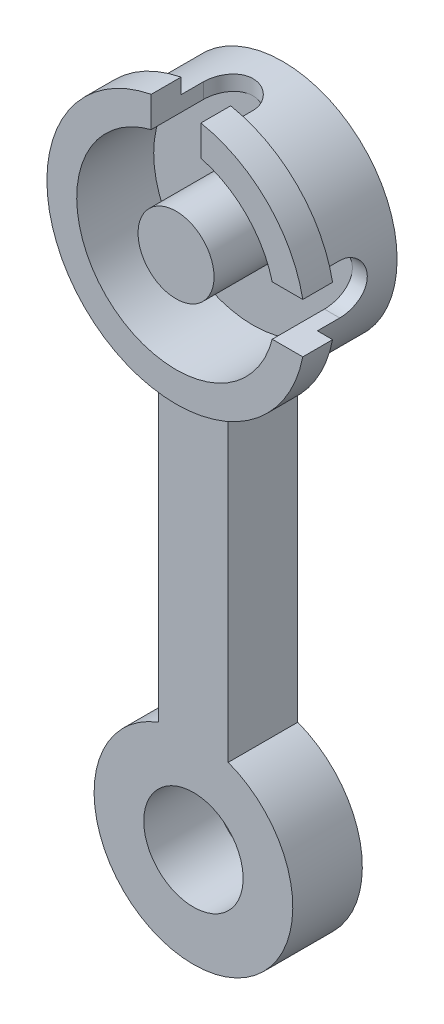
ISO-10303-21;
HEADER;
FILE_DESCRIPTION(('STEP AP214'),'2;1');
FILE_NAME('part.step','',(''),(''),'','','');
FILE_SCHEMA(('AUTOMOTIVE_DESIGN { 1 0 10303 214 1 1 1 1 }'));
ENDSEC;
DATA;
#1=APPLICATION_CONTEXT('core data for automotive mechanical design processes');
#2=APPLICATION_PROTOCOL_DEFINITION('international standard','automotive_design',2000,#1);
#3=PRODUCT_CONTEXT('',#1,'mechanical');
#4=PRODUCT('Part','Part','',(#3));
#5=PRODUCT_RELATED_PRODUCT_CATEGORY('part','',(#4));
#6=PRODUCT_DEFINITION_FORMATION('','',#4);
#7=PRODUCT_DEFINITION_CONTEXT('part definition',#1,'design');
#8=PRODUCT_DEFINITION('design','',#6,#7);
#9=PRODUCT_DEFINITION_SHAPE('','',#8);
#10=(LENGTH_UNIT() NAMED_UNIT(*) SI_UNIT(.MILLI.,.METRE.));
#11=(NAMED_UNIT(*) PLANE_ANGLE_UNIT() SI_UNIT($,.RADIAN.));
#12=(NAMED_UNIT(*) SI_UNIT($,.STERADIAN.) SOLID_ANGLE_UNIT());
#13=UNCERTAINTY_MEASURE_WITH_UNIT(LENGTH_MEASURE(1.E-05),#10,'distance_accuracy_value','');
#14=(GEOMETRIC_REPRESENTATION_CONTEXT(3) GLOBAL_UNCERTAINTY_ASSIGNED_CONTEXT((#13)) GLOBAL_UNIT_ASSIGNED_CONTEXT((#10,
#11,#12)) REPRESENTATION_CONTEXT('',''));
#15=CARTESIAN_POINT('',(0.,0.,0.));
#16=DIRECTION('',(0.,0.,1.));
#17=DIRECTION('',(1.,0.,0.));
#18=AXIS2_PLACEMENT_3D('',#15,#16,#17);
#19=CARTESIAN_POINT('',(0.,0.,10.75));
#20=DIRECTION('',(0.,0.,1.));
#21=DIRECTION('',(1.,0.,0.));
#22=AXIS2_PLACEMENT_3D('',#19,#20,#21);
#23=PLANE('',#22);
#24=DIRECTION('',(1.,0.,0.));
#25=VECTOR('',#24,1.);
#26=CARTESIAN_POINT('',(-13.001,2.5,10.75));
#27=LINE('',#26,#25);
#28=CARTESIAN_POINT('',(9.68245836551854,2.5,10.75));
#29=VERTEX_POINT('',#28);
#30=CARTESIAN_POINT('',(12.7573508221731,2.5,10.75));
#31=VERTEX_POINT('',#30);
#32=EDGE_CURVE('E188',#29,#31,#27,.T.);
#33=ORIENTED_EDGE('',*,*,#32,.T.);
#34=CARTESIAN_POINT('',(0.,0.,10.75));
#35=DIRECTION('',(0.,0.,1.));
#36=DIRECTION('',(1.,0.,0.));
#37=AXIS2_PLACEMENT_3D('',#34,#35,#36);
#38=CIRCLE('',#37,13.);
#39=CARTESIAN_POINT('',(2.5,12.7573508221731,10.75));
#40=VERTEX_POINT('',#39);
#41=EDGE_CURVE('E296',#31,#40,#38,.T.);
#42=ORIENTED_EDGE('',*,*,#41,.T.);
#43=DIRECTION('',(0.,-1.,0.));
#44=VECTOR('',#43,1.);
#45=CARTESIAN_POINT('',(2.5,13.,10.75));
#46=LINE('',#45,#44);
#47=CARTESIAN_POINT('',(2.5,9.68245836551854,10.75));
#48=VERTEX_POINT('',#47);
#49=EDGE_CURVE('E409',#40,#48,#46,.T.);
#50=ORIENTED_EDGE('',*,*,#49,.T.);
#51=CARTESIAN_POINT('',(0.,0.,10.75));
#52=DIRECTION('',(0.,0.,1.));
#53=DIRECTION('',(1.,0.,0.));
#54=AXIS2_PLACEMENT_3D('',#51,#52,#53);
#55=CIRCLE('',#54,10.);
#56=EDGE_CURVE('E272',#29,#48,#55,.T.);
#57=ORIENTED_EDGE('',*,*,#56,.F.);
#58=EDGE_LOOP('',(#33,#42,#50,#57));
#59=FACE_BOUND('',#58,.T.);
#60=ADVANCED_FACE('F49',(#59),#23,.T.);
#61=CARTESIAN_POINT('',(0.,0.,7.75));
#62=DIRECTION('',(0.,0.,1.));
#63=DIRECTION('',(1.,0.,0.));
#64=AXIS2_PLACEMENT_3D('',#61,#62,#63);
#65=PLANE('',#64);
#66=CARTESIAN_POINT('',(0.,0.,7.75));
#67=DIRECTION('',(0.,0.,1.));
#68=DIRECTION('',(1.,0.,0.));
#69=AXIS2_PLACEMENT_3D('',#66,#67,#68);
#70=CIRCLE('',#69,13.);
#71=CARTESIAN_POINT('',(12.7573508221731,2.5,7.75));
#72=VERTEX_POINT('',#71);
#73=CARTESIAN_POINT('',(2.5,12.7573508221731,7.75));
#74=VERTEX_POINT('',#73);
#75=EDGE_CURVE('E293',#72,#74,#70,.T.);
#76=ORIENTED_EDGE('',*,*,#75,.F.);
#77=DIRECTION('',(-1.,0.,0.));
#78=VECTOR('',#77,1.);
#79=CARTESIAN_POINT('',(0.,2.5,7.75));
#80=LINE('',#79,#78);
#81=CARTESIAN_POINT('',(11.2249721603218,2.5,7.75));
#82=VERTEX_POINT('',#81);
#83=EDGE_CURVE('E396',#72,#82,#80,.T.);
#84=ORIENTED_EDGE('',*,*,#83,.T.);
#85=CARTESIAN_POINT('',(0.,0.,7.75));
#86=DIRECTION('',(0.,0.,1.));
#87=DIRECTION('',(1.,0.,0.));
#88=AXIS2_PLACEMENT_3D('',#85,#86,#87);
#89=CIRCLE('',#88,11.5);
#90=CARTESIAN_POINT('',(2.5,11.2249721603218,7.75));
#91=VERTEX_POINT('',#90);
#92=EDGE_CURVE('E286',#82,#91,#89,.T.);
#93=ORIENTED_EDGE('',*,*,#92,.T.);
#94=DIRECTION('',(0.,-1.,0.));
#95=VECTOR('',#94,1.);
#96=CARTESIAN_POINT('',(2.5,0.,7.75));
#97=LINE('',#96,#95);
#98=EDGE_CURVE('E509',#74,#91,#97,.T.);
#99=ORIENTED_EDGE('',*,*,#98,.F.);
#100=EDGE_LOOP('',(#76,#84,#93,#99));
#101=FACE_BOUND('',#100,.T.);
#102=ADVANCED_FACE('F231',(#101),#65,.F.);
#103=CARTESIAN_POINT('',(0.,0.,3.));
#104=DIRECTION('',(0.,0.,1.));
#105=DIRECTION('',(1.,0.,0.));
#106=AXIS2_PLACEMENT_3D('',#103,#104,#105);
#107=CYLINDRICAL_SURFACE('',#106,10.);
#108=CARTESIAN_POINT('',(9.68245836551854,2.5,5.5));
#109=CARTESIAN_POINT('',(9.68245064111954,2.50000800974504,5.43086227280621));
#110=CARTESIAN_POINT('',(9.68319871091904,2.49713210596378,5.36172929639093));
#111=CARTESIAN_POINT('',(9.68614914952023,2.48567468034436,5.2239803055767));
#112=CARTESIAN_POINT('',(9.68835127361669,2.47709411855104,5.15536420615649));
#113=CARTESIAN_POINT('',(9.69414684169818,2.45431205402949,5.01926728400853));
#114=CARTESIAN_POINT('',(9.69773753079726,2.44012167982618,4.95178448771837));
#115=CARTESIAN_POINT('',(9.70619671915876,2.40625177112362,4.81831129889242));
#116=CARTESIAN_POINT('',(9.71106523596932,2.38657216124157,4.75232092686532));
#117=CARTESIAN_POINT('',(9.72738389223981,2.3195147166506,4.5572876221195));
#118=CARTESIAN_POINT('',(9.74055328364126,2.26409556017785,4.43104808852016));
#119=CARTESIAN_POINT('',(9.76997943748827,2.13353026793965,4.18969003166774));
#120=CARTESIAN_POINT('',(9.78623691860425,2.0583795386182,4.07457410656478));
#121=CARTESIAN_POINT('',(9.82040471070009,1.88872144910605,3.85615879668431));
#122=CARTESIAN_POINT('',(9.83834118174241,1.79386340609068,3.75313540100376));
#123=CARTESIAN_POINT('',(9.8736241781519,1.5882101662538,3.56425976600193));
#124=CARTESIAN_POINT('',(9.89097048991423,1.47740927331203,3.47841369017582));
#125=CARTESIAN_POINT('',(9.92341282190624,1.24108599319256,3.32518457241635));
#126=CARTESIAN_POINT('',(9.93847296605804,1.11537511690239,3.25808424707065));
#127=CARTESIAN_POINT('',(9.96431943243333,0.854105761894246,3.14614104580278));
#128=CARTESIAN_POINT('',(9.97511087403299,0.718559311205587,3.10127149251002));
#129=CARTESIAN_POINT('',(9.98867229260218,0.485279343468635,3.04560969025209));
#130=CARTESIAN_POINT('',(9.9928981973571,0.389082296243319,3.02853552258369));
#131=CARTESIAN_POINT('',(9.99856328967575,0.195270005752428,3.00572864199598));
#132=CARTESIAN_POINT('',(10.0000025178695,0.0976547831848832,2.99999576371964));
#133=CARTESIAN_POINT('',(9.99999643984856,-0.138079364435491,3.00000598990527));
#134=CARTESIAN_POINT('',(9.99711044622291,-0.2762378210569,3.01148199624813));
#135=CARTESIAN_POINT('',(9.98587211243723,-0.548630748226368,3.05702817811172));
#136=CARTESIAN_POINT('',(9.97751456301735,-0.682861351858222,3.09111988559121));
#137=CARTESIAN_POINT('',(9.95626003812502,-0.943370540040465,3.18073355599173));
#138=CARTESIAN_POINT('',(9.9433692599934,-1.06965970480532,3.23622627172547));
#139=CARTESIAN_POINT('',(9.9144214653489,-1.31112745670224,3.36697347226555));
#140=CARTESIAN_POINT('',(9.89836452937225,-1.42630632633127,3.442227454429));
#141=CARTESIAN_POINT('',(9.86445729325103,-1.64466717764041,3.61199909260045));
#142=CARTESIAN_POINT('',(9.84657931691399,-1.74758787227268,3.70684729452461));
#143=CARTESIAN_POINT('',(9.81122777715724,-1.93624440690088,3.91241613789223));
#144=CARTESIAN_POINT('',(9.79375427851752,-2.02197751079625,4.02313930167405));
#145=CARTESIAN_POINT('',(9.76090816361151,-2.17506654391142,4.25935711490929));
#146=CARTESIAN_POINT('',(9.7455713425268,-2.24212473012634,4.38504994898195));
#147=CARTESIAN_POINT('',(9.7191510873392,-2.35402373300668,4.64634157014611));
#148=CARTESIAN_POINT('',(9.70806446116543,-2.39888123069792,4.78193283163854));
#149=CARTESIAN_POINT('',(9.69412529347839,-2.45448264347137,5.0152094996293));
#150=CARTESIAN_POINT('',(9.68977829435311,-2.47152506219244,5.11135088492528));
#151=CARTESIAN_POINT('',(9.68393257034592,-2.49429083020696,5.30497755356269));
#152=CARTESIAN_POINT('',(9.68243179415941,-2.50002233152573,5.40246181799697));
#153=CARTESIAN_POINT('',(9.68245836551854,-2.5,5.5));
#154=B_SPLINE_CURVE_WITH_KNOTS('',3,(#108,#109,#110,#111,#112,#113,#114,#115,#116,#117,#118,
#119,#120,#121,#122,#123,#124,#125,#126,#127,#128,#129,#130,#131,#132,#133,#134,#135,#136,#137,
#138,#139,#140,#141,#142,#143,#144,#145,#146,#147,#148,#149,#150,#151,#152,#153),.UNSPECIFIED.,
.F.,.F.,(4,2,2,2,2,2,2,2,2,2,2,2,2,2,2,2,2,2,2,2,2,2,4),(0.,0.207341152049354,0.414647419197843,
0.621544487536569,0.828444397299515,1.24183999916585,1.65533192595269,2.0769323957609,
2.49868387230349,2.92648938525965,3.35378027205341,3.64649296502377,3.93920139018486,
4.35307761818935,4.76734845612808,5.1810551353743,5.59475129269416,6.01609891165583,
6.43751355197311,6.86530561437562,7.29277575498499,7.58532050743325,7.87765433937318),.UNSPECIFIED.);
#155=CARTESIAN_POINT('',(9.68245836551854,2.5,5.5));
#156=VERTEX_POINT('',#155);
#157=CARTESIAN_POINT('',(10.,0.,3.));
#158=VERTEX_POINT('',#157);
#159=EDGE_CURVE('E65',#156,#158,#154,.T.);
#160=ORIENTED_EDGE('',*,*,#159,.F.);
#161=DIRECTION('',(0.,0.,1.));
#162=VECTOR('',#161,1.);
#163=CARTESIAN_POINT('',(9.68245836551854,2.5,3.));
#164=LINE('',#163,#162);
#165=EDGE_CURVE('E192',#29,#156,#164,.F.);
#166=ORIENTED_EDGE('',*,*,#165,.F.);
#167=ORIENTED_EDGE('',*,*,#56,.T.);
#168=DIRECTION('',(0.,0.,1.));
#169=VECTOR('',#168,1.);
#170=CARTESIAN_POINT('',(2.5,9.68245836551854,3.));
#171=LINE('',#170,#169);
#172=CARTESIAN_POINT('',(2.5,9.68245836551854,5.5));
#173=VERTEX_POINT('',#172);
#174=EDGE_CURVE('E11',#173,#48,#171,.T.);
#175=ORIENTED_EDGE('',*,*,#174,.F.);
#176=CARTESIAN_POINT('',(-2.5,9.68245836551854,5.5));
#177=CARTESIAN_POINT('',(-2.5000080093561,9.68245064107173,5.43086221485037));
#178=CARTESIAN_POINT('',(-2.49713210094488,9.68319871214971,5.361729180435));
#179=CARTESIAN_POINT('',(-2.4856746565857,9.68614915569249,5.22398007541582));
#180=CARTESIAN_POINT('',(-2.477094080727,9.68835128344071,5.15536391978676));
#181=CARTESIAN_POINT('',(-2.4543119967113,9.69414685608169,5.01926700190048));
#182=CARTESIAN_POINT('',(-2.4401216265234,9.69773754375151,4.95178426440452));
#183=CARTESIAN_POINT('',(-2.40625174004096,9.70619672728078,4.81831118968971));
#184=CARTESIAN_POINT('',(-2.3865721482595,9.71106524071264,4.7523208730079));
#185=CARTESIAN_POINT('',(-2.31951549528412,9.7273836995917,4.55728991890444));
#186=CARTESIAN_POINT('',(-2.26409745840538,9.74055281563065,4.4310525501598));
#187=CARTESIAN_POINT('',(-2.13353299875773,9.76997886207529,4.18969412537827));
#188=CARTESIAN_POINT('',(-2.05838128580475,9.78623662015741,4.07457606152992));
#189=CARTESIAN_POINT('',(-1.88871268115754,9.82040642202059,3.85614780909068));
#190=CARTESIAN_POINT('',(-1.79384357452292,9.83834473874501,3.75311479878795));
#191=CARTESIAN_POINT('',(-1.58818904866331,9.87362764688863,3.56424276156979));
#192=CARTESIAN_POINT('',(-1.47740109012642,9.89097214303631,3.47840648304886));
#193=CARTESIAN_POINT('',(-1.24114235858888,9.92340454696925,3.32522304681061));
#194=CARTESIAN_POINT('',(-1.11548838031036,9.93845761433587,3.25815040752711));
#195=CARTESIAN_POINT('',(-0.854256447638928,9.96430865897157,3.14618801705023));
#196=CARTESIAN_POINT('',(-0.718680452386957,9.97510747358589,3.10129390011676));
#197=CARTESIAN_POINT('',(-0.44436027897514,9.99104749942438,3.03585255639782));
#198=CARTESIAN_POINT('',(-0.305735807058583,9.99629882234408,3.01483082920823));
#199=CARTESIAN_POINT('',(-0.026831937153017,10.0009359539588,2.99624156087777));
#200=CARTESIAN_POINT('',(0.11344725061566,10.0003224998861,2.99867107179753));
#201=CARTESIAN_POINT('',(0.388381231898417,9.99338093409452,3.02657491187484));
#202=CARTESIAN_POINT('',(0.523091754207089,9.98717996692084,3.05153654221199));
#203=CARTESIAN_POINT('',(0.786346777853404,9.96990826592558,3.12297169724353));
#204=CARTESIAN_POINT('',(0.914891006098329,9.95883731664275,3.1694461737295));
#205=CARTESIAN_POINT('',(1.16351821502264,9.93287494404107,3.2830032018703));
#206=CARTESIAN_POINT('',(1.28351407399524,9.91794984568668,3.35026848563402));
#207=CARTESIAN_POINT('',(1.51069157808542,9.88589863855019,3.50335782453174));
#208=CARTESIAN_POINT('',(1.61787128890855,9.86877219833489,3.58918467561906));
#209=CARTESIAN_POINT('',(1.81942347426832,9.83363915056657,3.77969728021763));
#210=CARTESIAN_POINT('',(1.9133727576345,9.81562126192392,3.88482909135298));
#211=CARTESIAN_POINT('',(2.08242393796641,9.78115420711838,4.10957466731588));
#212=CARTESIAN_POINT('',(2.15752067561301,9.76470547114267,4.22919238320947));
#213=CARTESIAN_POINT('',(2.28701177321454,9.73519533958994,4.48036399455884));
#214=CARTESIAN_POINT('',(2.34129254471755,9.72215264997332,4.61197866223443));
#215=CARTESIAN_POINT('',(2.42675587962519,9.70117647043109,4.88279232105148));
#216=CARTESIAN_POINT('',(2.45797297303244,9.693235344986,5.02197963789711));
#217=CARTESIAN_POINT('',(2.48476158787698,9.6863822666606,5.21864345189183));
#218=CARTESIAN_POINT('',(2.49047697741524,9.68491307675692,5.27479925801593));
#219=CARTESIAN_POINT('',(2.49809189424097,9.6829515607634,5.38729447474745));
#220=CARTESIAN_POINT('',(2.49999759523778,9.68245765421489,5.44363343986511));
#221=CARTESIAN_POINT('',(2.5,9.68245836551854,5.5));
#222=B_SPLINE_CURVE_WITH_KNOTS('',3,(#176,#177,#178,#179,#180,#181,#182,#183,#184,#185,#186,
#187,#188,#189,#190,#191,#192,#193,#194,#195,#196,#197,#198,#199,#200,#201,#202,#203,#204,#205,
#206,#207,#208,#209,#210,#211,#212,#213,#214,#215,#216,#217,#218,#219,#220,#221),.UNSPECIFIED.,
.F.,.F.,(4,2,2,2,2,2,2,2,2,2,2,2,2,2,2,2,2,2,2,2,2,2,4),(0.,0.207341325849423,0.414647765211628,
0.621544658575865,0.82844439729415,1.24183269482211,1.65533192641023,2.07697423316329,
2.49868387344134,2.92627416704923,3.35378025790397,3.77263152747648,4.19143014600933,
4.60093312657524,5.01045422648931,5.42368222585276,5.83697251370157,6.26140522795691,
6.68595396911754,7.11278749362004,7.538980678093,7.70826570767018,7.87727618290648),.UNSPECIFIED.);
#223=CARTESIAN_POINT('',(0.,10.,3.));
#224=VERTEX_POINT('',#223);
#225=EDGE_CURVE('E430',#224,#173,#222,.T.);
#226=ORIENTED_EDGE('',*,*,#225,.F.);
#227=CARTESIAN_POINT('',(0.,0.,3.));
#228=DIRECTION('',(0.,0.,1.));
#229=DIRECTION('',(1.,0.,0.));
#230=AXIS2_PLACEMENT_3D('',#227,#228,#229);
#231=CIRCLE('',#230,10.);
#232=EDGE_CURVE('E203',#158,#224,#231,.T.);
#233=ORIENTED_EDGE('',*,*,#232,.F.);
#234=EDGE_LOOP('',(#160,#166,#167,#175,#226,#233));
#235=FACE_BOUND('',#234,.T.);
#236=ADVANCED_FACE('F201',(#235),#107,.F.);
#237=DIRECTION('',(1.,0.,0.));
#238=VECTOR('',#237,1.);
#239=CARTESIAN_POINT('',(-13.001,-2.5,10.75));
#240=LINE('',#239,#238);
#241=CARTESIAN_POINT('',(9.68245836551854,-2.5,10.75));
#242=VERTEX_POINT('',#241);
#243=CARTESIAN_POINT('',(12.7573508221731,-2.5,10.75));
#244=VERTEX_POINT('',#243);
#245=EDGE_CURVE('E259',#242,#244,#240,.T.);
#246=ORIENTED_EDGE('',*,*,#245,.F.);
#247=CARTESIAN_POINT('',(-2.5,9.68245836551854,10.75));
#248=VERTEX_POINT('',#247);
#249=EDGE_CURVE('E261',#248,#242,#55,.T.);
#250=ORIENTED_EDGE('',*,*,#249,.F.);
#251=DIRECTION('',(0.,-1.,0.));
#252=VECTOR('',#251,1.);
#253=CARTESIAN_POINT('',(-2.5,13.,10.75));
#254=LINE('',#253,#252);
#255=CARTESIAN_POINT('',(-2.5,12.7573508221731,10.75));
#256=VERTEX_POINT('',#255);
#257=EDGE_CURVE('E73',#256,#248,#254,.T.);
#258=ORIENTED_EDGE('',*,*,#257,.F.);
#259=EDGE_CURVE('E263',#256,#244,#38,.T.);
#260=ORIENTED_EDGE('',*,*,#259,.T.);
#261=EDGE_LOOP('',(#246,#250,#258,#260));
#262=FACE_BOUND('',#261,.T.);
#263=ADVANCED_FACE('F234',(#262),#23,.T.);
#264=CARTESIAN_POINT('',(0.,0.,7.75));
#265=DIRECTION('',(0.,0.,1.));
#266=DIRECTION('',(1.,0.,0.));
#267=AXIS2_PLACEMENT_3D('',#264,#265,#266);
#268=CYLINDRICAL_SURFACE('',#267,13.);
#269=DIRECTION('',(0.,0.,1.));
#270=VECTOR('',#269,1.);
#271=CARTESIAN_POINT('',(12.7573508221731,2.5,7.75));
#272=LINE('',#271,#270);
#273=EDGE_CURVE('E400',#72,#31,#272,.T.);
#274=ORIENTED_EDGE('',*,*,#273,.F.);
#275=ORIENTED_EDGE('',*,*,#75,.T.);
#276=DIRECTION('',(0.,0.,1.));
#277=VECTOR('',#276,1.);
#278=CARTESIAN_POINT('',(2.5,12.7573508221731,7.75));
#279=LINE('',#278,#277);
#280=EDGE_CURVE('E513',#74,#40,#279,.T.);
#281=ORIENTED_EDGE('',*,*,#280,.T.);
#282=ORIENTED_EDGE('',*,*,#41,.F.);
#283=EDGE_LOOP('',(#274,#275,#281,#282));
#284=FACE_BOUND('',#283,.T.);
#285=ADVANCED_FACE('F246',(#284),#268,.T.);
#286=DIRECTION('',(0.,0.,1.));
#287=VECTOR('',#286,1.);
#288=CARTESIAN_POINT('',(12.7573508221731,-2.5,7.75));
#289=LINE('',#288,#287);
#290=CARTESIAN_POINT('',(12.7573508221731,-2.5,7.75));
#291=VERTEX_POINT('',#290);
#292=EDGE_CURVE('E390',#244,#291,#289,.F.);
#293=ORIENTED_EDGE('',*,*,#292,.F.);
#294=ORIENTED_EDGE('',*,*,#259,.F.);
#295=DIRECTION('',(0.,0.,1.));
#296=VECTOR('',#295,1.);
#297=CARTESIAN_POINT('',(-2.5,12.7573508221731,7.75));
#298=LINE('',#297,#296);
#299=CARTESIAN_POINT('',(-2.5,12.7573508221731,7.75));
#300=VERTEX_POINT('',#299);
#301=EDGE_CURVE('E502',#300,#256,#298,.T.);
#302=ORIENTED_EDGE('',*,*,#301,.F.);
#303=CARTESIAN_POINT('',(-3.49999999999999,-12.5199840255489,7.75));
#304=VERTEX_POINT('',#303);
#305=EDGE_CURVE('E285',#300,#304,#70,.T.);
#306=ORIENTED_EDGE('',*,*,#305,.T.);
#307=DIRECTION('',(0.,0.,1.));
#308=VECTOR('',#307,1.);
#309=CARTESIAN_POINT('',(-3.49999999999999,-12.5199840255489,7.75));
#310=LINE('',#309,#308);
#311=CARTESIAN_POINT('',(-3.49999999999999,-12.5199840255489,9.));
#312=VERTEX_POINT('',#311);
#313=EDGE_CURVE('E362',#304,#312,#310,.T.);
#314=ORIENTED_EDGE('',*,*,#313,.T.);
#315=CARTESIAN_POINT('',(0.,0.,9.));
#316=DIRECTION('',(0.,0.,-1.));
#317=DIRECTION('',(-1.,0.,0.));
#318=AXIS2_PLACEMENT_3D('',#315,#316,#317);
#319=CIRCLE('',#318,13.);
#320=CARTESIAN_POINT('',(3.50000000000001,-12.5199840255489,9.));
#321=VERTEX_POINT('',#320);
#322=EDGE_CURVE('E300',#321,#312,#319,.T.);
#323=ORIENTED_EDGE('',*,*,#322,.F.);
#324=DIRECTION('',(0.,0.,1.));
#325=VECTOR('',#324,1.);
#326=CARTESIAN_POINT('',(3.50000000000001,-12.5199840255489,7.75));
#327=LINE('',#326,#325);
#328=CARTESIAN_POINT('',(3.50000000000001,-12.5199840255489,7.75));
#329=VERTEX_POINT('',#328);
#330=EDGE_CURVE('E304',#321,#329,#327,.F.);
#331=ORIENTED_EDGE('',*,*,#330,.T.);
#332=EDGE_CURVE('E288',#329,#291,#70,.T.);
#333=ORIENTED_EDGE('',*,*,#332,.T.);
#334=EDGE_LOOP('',(#293,#294,#302,#306,#314,#323,#331,#333));
#335=FACE_BOUND('',#334,.T.);
#336=ADVANCED_FACE('F252',(#335),#268,.T.);
#337=CARTESIAN_POINT('',(3.50000000000001,-10.9544511501033,7.75));
#338=VERTEX_POINT('',#337);
#339=CARTESIAN_POINT('',(11.2249721603218,-2.5,7.75));
#340=VERTEX_POINT('',#339);
#341=EDGE_CURVE('E281',#338,#340,#89,.T.);
#342=ORIENTED_EDGE('',*,*,#341,.T.);
#343=DIRECTION('',(1.,0.,0.));
#344=VECTOR('',#343,1.);
#345=CARTESIAN_POINT('',(0.,-2.5,7.75));
#346=LINE('',#345,#344);
#347=EDGE_CURVE('E382',#340,#291,#346,.T.);
#348=ORIENTED_EDGE('',*,*,#347,.T.);
#349=ORIENTED_EDGE('',*,*,#332,.F.);
#350=DIRECTION('',(0.,-1.,0.));
#351=VECTOR('',#350,1.);
#352=CARTESIAN_POINT('',(3.50000000000001,-10.2329555021434,7.75));
#353=LINE('',#352,#351);
#354=EDGE_CURVE('E292',#338,#329,#353,.T.);
#355=ORIENTED_EDGE('',*,*,#354,.F.);
#356=EDGE_LOOP('',(#342,#348,#349,#355));
#357=FACE_BOUND('',#356,.T.);
#358=ADVANCED_FACE('F241',(#357),#65,.F.);
#359=CARTESIAN_POINT('',(0.,0.,-32.5269119345812));
#360=DIRECTION('',(0.,0.,1.));
#361=DIRECTION('',(1.,0.,0.));
#362=AXIS2_PLACEMENT_3D('',#359,#360,#361);
#363=CYLINDRICAL_SURFACE('',#362,11.5);
#364=ORIENTED_EDGE('',*,*,#92,.F.);
#365=DIRECTION('',(0.,0.,1.));
#366=VECTOR('',#365,1.);
#367=CARTESIAN_POINT('',(11.2249721603218,2.5,-32.5269119345812));
#368=LINE('',#367,#366);
#369=CARTESIAN_POINT('',(11.2249721603218,2.5,5.5));
#370=VERTEX_POINT('',#369);
#371=EDGE_CURVE('E393',#82,#370,#368,.F.);
#372=ORIENTED_EDGE('',*,*,#371,.T.);
#373=CARTESIAN_POINT('',(11.2249721603218,2.5,5.5));
#374=CARTESIAN_POINT('',(11.2249655564128,2.50000770023841,5.43057318762101));
#375=CARTESIAN_POINT('',(11.2256161253679,2.49710804805403,5.36115073185148));
#376=CARTESIAN_POINT('',(11.2281826844831,2.48555379225623,5.2228192356887));
#377=CARTESIAN_POINT('',(11.2300985001111,2.47689998238834,5.15391012580853));
#378=CARTESIAN_POINT('',(11.2351424450603,2.45391630903447,5.01720465167941));
#379=CARTESIAN_POINT('',(11.238268547916,2.43959593258299,4.94940662381869));
#380=CARTESIAN_POINT('',(11.2456354137294,2.40540795244249,4.8153050073435));
#381=CARTESIAN_POINT('',(11.2498761846651,2.38554030904961,4.74900142942905));
#382=CARTESIAN_POINT('',(11.2640963755143,2.3178204149057,4.55302138495965));
#383=CARTESIAN_POINT('',(11.2755783261195,2.26183127294234,4.42615805077818));
#384=CARTESIAN_POINT('',(11.3012444304375,2.12987388674848,4.18366919370035));
#385=CARTESIAN_POINT('',(11.3154290084151,2.05390250494617,4.06804543952892));
#386=CARTESIAN_POINT('',(11.3451653788676,1.88277923447347,3.84933543388514));
#387=CARTESIAN_POINT('',(11.3607343523547,1.78735916318843,3.74646096152355));
#388=CARTESIAN_POINT('',(11.3913359056992,1.58062227487353,3.55804163823671));
#389=CARTESIAN_POINT('',(11.4063684014374,1.46930297842818,3.4724994952551));
#390=CARTESIAN_POINT('',(11.4343903316101,1.23250040933111,3.32033275892382));
#391=CARTESIAN_POINT('',(11.4473569706169,1.10688226577332,3.253913472141));
#392=CARTESIAN_POINT('',(11.4695901218325,0.8459454215435,3.14321090217215));
#393=CARTESIAN_POINT('',(11.4788572392302,0.710628311759239,3.09892399814577));
#394=CARTESIAN_POINT('',(11.4925259318873,0.43635033310039,3.03440929647195));
#395=CARTESIAN_POINT('',(11.4970005654608,0.29747822798135,3.01381987254695));
#396=CARTESIAN_POINT('',(11.5008332359296,0.0181805204381982,2.99615411997446));
#397=CARTESIAN_POINT('',(11.5001917342962,-0.122244940733519,2.99907567065697));
#398=CARTESIAN_POINT('',(11.4939201098597,-0.398164061943788,3.02808008774749));
#399=CARTESIAN_POINT('',(11.4883740638508,-0.533700946220194,3.05377261603943));
#400=CARTESIAN_POINT('',(11.4730123118418,-0.798491122865524,3.1269676595539));
#401=CARTESIAN_POINT('',(11.4631964478841,-0.927744182574045,3.17447098164823));
#402=CARTESIAN_POINT('',(11.44026237257,-1.17738648286924,3.29028636692073));
#403=CARTESIAN_POINT('',(11.4271206920164,-1.29770452033096,3.35874707115945));
#404=CARTESIAN_POINT('',(11.3989770704252,-1.52528342719426,3.51442132952629));
#405=CARTESIAN_POINT('',(11.383974933397,-1.63254291857523,3.60163686010093));
#406=CARTESIAN_POINT('',(11.3533979252074,-1.8332730652095,3.79445866451163));
#407=CARTESIAN_POINT('',(11.3378176153942,-1.92641695831477,3.90040449352148));
#408=CARTESIAN_POINT('',(11.3081238104254,-2.09369957643296,4.12660659876711));
#409=CARTESIAN_POINT('',(11.294010718214,-2.16783308875217,4.24686678682859));
#410=CARTESIAN_POINT('',(11.2688326320994,-2.29513678760847,4.4988261815173));
#411=CARTESIAN_POINT('',(11.2577783039506,-2.34823389232037,4.63056336008541));
#412=CARTESIAN_POINT('',(11.2401196235476,-2.4313674244412,4.90130469229444));
#413=CARTESIAN_POINT('',(11.233508646234,-2.46143819360415,5.04029769248469));
#414=CARTESIAN_POINT('',(11.2280042651788,-2.48635269662178,5.23369424044576));
#415=CARTESIAN_POINT('',(11.2268686294992,-2.49147194818671,5.2868661365721));
#416=CARTESIAN_POINT('',(11.2253531179659,-2.49829143985717,5.39335055566514));
#417=CARTESIAN_POINT('',(11.2249719864102,-2.49999736073343,5.4466626968681));
#418=CARTESIAN_POINT('',(11.2249721603218,-2.5,5.5));
#419=B_SPLINE_CURVE_WITH_KNOTS('',3,(#373,#374,#375,#376,#377,#378,#379,#380,#381,#382,#383,
#384,#385,#386,#387,#388,#389,#390,#391,#392,#393,#394,#395,#396,#397,#398,#399,#400,#401,#402,
#403,#404,#405,#406,#407,#408,#409,#410,#411,#412,#413,#414,#415,#416,#417,#418),.UNSPECIFIED.,
.F.,.F.,(4,2,2,2,2,2,2,2,2,2,2,2,2,2,2,2,2,2,2,2,2,2,4),(0.,0.208209283768426,0.416389852488539,
0.624223347521161,0.832058330134043,1.2473748245096,1.662756570031,2.08430932358221,
2.5059278883892,2.93191726515821,3.35783692756835,3.77716703680105,4.1964593232367,
4.60870022669212,5.02095638187877,5.4362070205177,5.85150144112617,6.27528690206474,
6.69918844207525,7.12454999420687,7.54927591471206,7.70947591255798,7.869409068705),.UNSPECIFIED.);
#420=CARTESIAN_POINT('',(11.2249721603218,-2.5,5.5));
#421=VERTEX_POINT('',#420);
#422=EDGE_CURVE('E184',#370,#421,#419,.T.);
#423=ORIENTED_EDGE('',*,*,#422,.T.);
#424=DIRECTION('',(0.,0.,1.));
#425=VECTOR('',#424,1.);
#426=CARTESIAN_POINT('',(11.2249721603218,-2.5,-32.5269119345812));
#427=LINE('',#426,#425);
#428=EDGE_CURVE('E379',#421,#340,#427,.T.);
#429=ORIENTED_EDGE('',*,*,#428,.T.);
#430=ORIENTED_EDGE('',*,*,#341,.F.);
#431=DIRECTION('',(0.,0.,1.));
#432=VECTOR('',#431,1.);
#433=CARTESIAN_POINT('',(3.50000000000001,-10.9544511501033,-32.5269119345812));
#434=LINE('',#433,#432);
#435=CARTESIAN_POINT('',(3.50000000000001,-10.9544511501033,2.));
#436=VERTEX_POINT('',#435);
#437=EDGE_CURVE('E344',#338,#436,#434,.F.);
#438=ORIENTED_EDGE('',*,*,#437,.T.);
#439=CARTESIAN_POINT('',(0.,0.,2.));
#440=DIRECTION('',(0.,0.,1.));
#441=DIRECTION('',(1.,0.,0.));
#442=AXIS2_PLACEMENT_3D('',#439,#440,#441);
#443=CIRCLE('',#442,11.5);
#444=CARTESIAN_POINT('',(-3.49999999999999,-10.9544511501033,2.));
#445=VERTEX_POINT('',#444);
#446=EDGE_CURVE('E337',#445,#436,#443,.T.);
#447=ORIENTED_EDGE('',*,*,#446,.F.);
#448=DIRECTION('',(0.,0.,1.));
#449=VECTOR('',#448,1.);
#450=CARTESIAN_POINT('',(-3.49999999999999,-10.9544511501033,-32.5269119345812));
#451=LINE('',#450,#449);
#452=CARTESIAN_POINT('',(-3.49999999999999,-10.9544511501033,7.74999999999999));
#453=VERTEX_POINT('',#452);
#454=EDGE_CURVE('E348',#445,#453,#451,.T.);
#455=ORIENTED_EDGE('',*,*,#454,.T.);
#456=CARTESIAN_POINT('',(-2.5,11.2249721603218,7.75));
#457=VERTEX_POINT('',#456);
#458=EDGE_CURVE('E287',#457,#453,#89,.T.);
#459=ORIENTED_EDGE('',*,*,#458,.F.);
#460=DIRECTION('',(0.,0.,1.));
#461=VECTOR('',#460,1.);
#462=CARTESIAN_POINT('',(-2.5,11.2249721603218,-32.5269119345812));
#463=LINE('',#462,#461);
#464=CARTESIAN_POINT('',(-2.5,11.2249721603218,5.5));
#465=VERTEX_POINT('',#464);
#466=EDGE_CURVE('E429',#457,#465,#463,.F.);
#467=ORIENTED_EDGE('',*,*,#466,.T.);
#468=CARTESIAN_POINT('',(2.5,11.2249721603218,5.5));
#469=CARTESIAN_POINT('',(2.50000770023841,11.2249655564128,5.43057318762101));
#470=CARTESIAN_POINT('',(2.49710804805403,11.2256161253679,5.36115073185148));
#471=CARTESIAN_POINT('',(2.48555379225623,11.2281826844831,5.2228192356887));
#472=CARTESIAN_POINT('',(2.47689998238834,11.2300985001111,5.15391012580853));
#473=CARTESIAN_POINT('',(2.45391630903447,11.2351424450603,5.01720465167941));
#474=CARTESIAN_POINT('',(2.43959593258299,11.238268547916,4.94940662381869));
#475=CARTESIAN_POINT('',(2.40540795244249,11.2456354137294,4.8153050073435));
#476=CARTESIAN_POINT('',(2.38554030904961,11.2498761846651,4.74900142942905));
#477=CARTESIAN_POINT('',(2.3178204149057,11.2640963755143,4.55302138495965));
#478=CARTESIAN_POINT('',(2.26183127294234,11.2755783261195,4.42615805077818));
#479=CARTESIAN_POINT('',(2.12987388674848,11.3012444304375,4.18366919370035));
#480=CARTESIAN_POINT('',(2.05390250494617,11.3154290084151,4.06804543952891));
#481=CARTESIAN_POINT('',(1.88277923447347,11.3451653788676,3.84933543388514));
#482=CARTESIAN_POINT('',(1.78735916318843,11.3607343523547,3.74646096152355));
#483=CARTESIAN_POINT('',(1.58062227487353,11.3913359056992,3.55804163823671));
#484=CARTESIAN_POINT('',(1.46930297842818,11.4063684014374,3.4724994952551));
#485=CARTESIAN_POINT('',(1.23250040933111,11.4343903316101,3.32033275892382));
#486=CARTESIAN_POINT('',(1.10688226577332,11.4473569706169,3.253913472141));
#487=CARTESIAN_POINT('',(0.845945421543501,11.4695901218325,3.14321090217215));
#488=CARTESIAN_POINT('',(0.71062831175924,11.4788572392302,3.09892399814577));
#489=CARTESIAN_POINT('',(0.436350333100391,11.4925259318873,3.03440929647195));
#490=CARTESIAN_POINT('',(0.297478227981351,11.4970005654608,3.01381987254695));
#491=CARTESIAN_POINT('',(0.0181805204381988,11.5008332359296,2.99615411997446));
#492=CARTESIAN_POINT('',(-0.122244940733519,11.5001917342961,2.99907567065697));
#493=CARTESIAN_POINT('',(-0.398164061943787,11.4939201098597,3.02808008774749));
#494=CARTESIAN_POINT('',(-0.533700946220194,11.4883740638508,3.05377261603943));
#495=CARTESIAN_POINT('',(-0.798491122865523,11.4730123118418,3.1269676595539));
#496=CARTESIAN_POINT('',(-0.927744182574044,11.4631964478841,3.17447098164823));
#497=CARTESIAN_POINT('',(-1.17738648286924,11.44026237257,3.29028636692073));
#498=CARTESIAN_POINT('',(-1.29770452033096,11.4271206920164,3.35874707115945));
#499=CARTESIAN_POINT('',(-1.52528342719426,11.3989770704252,3.51442132952629));
#500=CARTESIAN_POINT('',(-1.63254291857523,11.383974933397,3.60163686010093));
#501=CARTESIAN_POINT('',(-1.8332730652095,11.3533979252074,3.79445866451163));
#502=CARTESIAN_POINT('',(-1.92641695831477,11.3378176153942,3.90040449352148));
#503=CARTESIAN_POINT('',(-2.09369957643295,11.3081238104254,4.12660659876711));
#504=CARTESIAN_POINT('',(-2.16783308875217,11.294010718214,4.24686678682859));
#505=CARTESIAN_POINT('',(-2.29513678760847,11.2688326320994,4.4988261815173));
#506=CARTESIAN_POINT('',(-2.34823389232037,11.2577783039506,4.63056336008541));
#507=CARTESIAN_POINT('',(-2.43136742444119,11.2401196235476,4.90130469229444));
#508=CARTESIAN_POINT('',(-2.46143819360415,11.233508646234,5.04029769248469));
#509=CARTESIAN_POINT('',(-2.48635269662178,11.2280042651788,5.23369424044576));
#510=CARTESIAN_POINT('',(-2.49147194818671,11.2268686294992,5.2868661365721));
#511=CARTESIAN_POINT('',(-2.49829143985717,11.2253531179659,5.39335055566514));
#512=CARTESIAN_POINT('',(-2.49999736073343,11.2249719864102,5.4466626968681));
#513=CARTESIAN_POINT('',(-2.5,11.2249721603218,5.5));
#514=B_SPLINE_CURVE_WITH_KNOTS('',3,(#468,#469,#470,#471,#472,#473,#474,#475,#476,#477,#478,
#479,#480,#481,#482,#483,#484,#485,#486,#487,#488,#489,#490,#491,#492,#493,#494,#495,#496,#497,
#498,#499,#500,#501,#502,#503,#504,#505,#506,#507,#508,#509,#510,#511,#512,#513),.UNSPECIFIED.,
.F.,.F.,(4,2,2,2,2,2,2,2,2,2,2,2,2,2,2,2,2,2,2,2,2,2,4),(0.,0.208209283768426,0.416389852488538,
0.624223347521161,0.832058330134043,1.2473748245096,1.662756570031,2.08430932358221,
2.5059278883892,2.93191726515821,3.35783692756835,3.77716703680105,4.1964593232367,
4.60870022669212,5.02095638187877,5.4362070205177,5.85150144112617,6.27528690206474,
6.69918844207525,7.12454999420687,7.54927591471206,7.70947591255798,7.869409068705),.UNSPECIFIED.);
#515=CARTESIAN_POINT('',(2.5,11.2249721603218,5.5));
#516=VERTEX_POINT('',#515);
#517=EDGE_CURVE('E420',#516,#465,#514,.T.);
#518=ORIENTED_EDGE('',*,*,#517,.F.);
#519=DIRECTION('',(0.,0.,1.));
#520=VECTOR('',#519,1.);
#521=CARTESIAN_POINT('',(2.5,11.2249721603218,-32.5269119345812));
#522=LINE('',#521,#520);
#523=EDGE_CURVE('E504',#91,#516,#522,.F.);
#524=ORIENTED_EDGE('',*,*,#523,.F.);
#525=EDGE_LOOP('',(#364,#372,#423,#429,#430,#438,#447,#455,#459,#467,#518,#524));
#526=FACE_BOUND('',#525,.T.);
#527=CARTESIAN_POINT('',(0.,0.,0.));
#528=DIRECTION('',(0.,0.,1.));
#529=DIRECTION('',(1.,0.,0.));
#530=AXIS2_PLACEMENT_3D('',#527,#528,#529);
#531=CIRCLE('',#530,11.5);
#532=CARTESIAN_POINT('',(11.5,0.,0.));
#533=VERTEX_POINT('',#532);
#534=EDGE_CURVE('E340',#533,#533,#531,.T.);
#535=ORIENTED_EDGE('',*,*,#534,.T.);
#536=EDGE_LOOP('',(#535));
#537=FACE_BOUND('',#536,.T.);
#538=ADVANCED_FACE('F411',(#526,#537),#363,.T.);
#539=ORIENTED_EDGE('',*,*,#249,.T.);
#540=DIRECTION('',(0.,0.,1.));
#541=VECTOR('',#540,1.);
#542=CARTESIAN_POINT('',(9.68245836551854,-2.5,3.));
#543=LINE('',#542,#541);
#544=CARTESIAN_POINT('',(9.68245836551854,-2.5,5.5));
#545=VERTEX_POINT('',#544);
#546=EDGE_CURVE('E189',#545,#242,#543,.T.);
#547=ORIENTED_EDGE('',*,*,#546,.F.);
#548=EDGE_CURVE('E198',#158,#545,#154,.T.);
#549=ORIENTED_EDGE('',*,*,#548,.F.);
#550=EDGE_CURVE('E276',#224,#158,#231,.T.);
#551=ORIENTED_EDGE('',*,*,#550,.F.);
#552=CARTESIAN_POINT('',(-2.5,9.68245836551854,5.5));
#553=VERTEX_POINT('',#552);
#554=EDGE_CURVE('E376',#553,#224,#222,.T.);
#555=ORIENTED_EDGE('',*,*,#554,.F.);
#556=DIRECTION('',(0.,0.,1.));
#557=VECTOR('',#556,1.);
#558=CARTESIAN_POINT('',(-2.5,9.68245836551854,3.));
#559=LINE('',#558,#557);
#560=EDGE_CURVE('E58',#553,#248,#559,.T.);
#561=ORIENTED_EDGE('',*,*,#560,.T.);
#562=EDGE_LOOP('',(#539,#547,#549,#551,#555,#561));
#563=FACE_BOUND('',#562,.T.);
#564=ADVANCED_FACE('F255',(#563),#107,.F.);
#565=ORIENTED_EDGE('',*,*,#305,.F.);
#566=DIRECTION('',(0.,-1.,0.));
#567=VECTOR('',#566,1.);
#568=CARTESIAN_POINT('',(-2.5,0.,7.75));
#569=LINE('',#568,#567);
#570=EDGE_CURVE('E495',#300,#457,#569,.T.);
#571=ORIENTED_EDGE('',*,*,#570,.T.);
#572=ORIENTED_EDGE('',*,*,#458,.T.);
#573=DIRECTION('',(0.,1.,0.));
#574=VECTOR('',#573,1.);
#575=CARTESIAN_POINT('',(-3.49999999999999,-61.5,7.75));
#576=LINE('',#575,#574);
#577=EDGE_CURVE('E355',#304,#453,#576,.T.);
#578=ORIENTED_EDGE('',*,*,#577,.F.);
#579=EDGE_LOOP('',(#565,#571,#572,#578));
#580=FACE_BOUND('',#579,.T.);
#581=ADVANCED_FACE('F242',(#580),#65,.F.);
#582=CARTESIAN_POINT('',(0.,0.,0.));
#583=DIRECTION('',(0.,0.,1.));
#584=DIRECTION('',(1.,0.,0.));
#585=AXIS2_PLACEMENT_3D('',#582,#583,#584);
#586=PLANE('',#585);
#587=ORIENTED_EDGE('',*,*,#534,.F.);
#588=EDGE_LOOP('',(#587));
#589=FACE_BOUND('',#588,.T.);
#590=ADVANCED_FACE('F51',(#589),#586,.F.);
#591=CARTESIAN_POINT('',(0.,-52.7249721603218,32.));
#592=DIRECTION('',(0.,0.,-1.));
#593=DIRECTION('',(-1.,0.,0.));
#594=AXIS2_PLACEMENT_3D('',#591,#592,#593);
#595=CYLINDRICAL_SURFACE('',#594,5.);
#596=CARTESIAN_POINT('',(0.,-52.7249721603218,2.));
#597=DIRECTION('',(0.,0.,-1.));
#598=DIRECTION('',(-1.,0.,0.));
#599=AXIS2_PLACEMENT_3D('',#596,#597,#598);
#600=CIRCLE('',#599,5.);
#601=CARTESIAN_POINT('',(-5.00000000000001,-52.7249721603218,2.));
#602=VERTEX_POINT('',#601);
#603=EDGE_CURVE('E307',#602,#602,#600,.T.);
#604=CARTESIAN_POINT('',(0.,-52.7249721603218,9.));
#605=DIRECTION('',(0.,0.,-1.));
#606=DIRECTION('',(-1.,0.,0.));
#607=AXIS2_PLACEMENT_3D('',#604,#605,#606);
#608=CIRCLE('',#607,5.);
#609=CARTESIAN_POINT('',(-5.00000000000001,-52.7249721603218,9.00000000000001));
#610=VERTEX_POINT('',#609);
#611=EDGE_CURVE('E311',#610,#610,#608,.T.);
#612=CARTESIAN_POINT('',(-5.00000000000001,-52.7249721603218,2.));
#613=CARTESIAN_POINT('',(-5.00000000000001,-52.7249721603218,2.07291666666666));
#614=CARTESIAN_POINT('',(-5.00000000000001,-52.7249721603218,2.14583333333333));
#615=CARTESIAN_POINT('',(-5.00000000000001,-52.7249721603218,2.29166666666667));
#616=CARTESIAN_POINT('',(-5.00000000000001,-52.7249721603218,2.36458333333333));
#617=CARTESIAN_POINT('',(-5.00000000000001,-52.7249721603218,2.51041666666667));
#618=CARTESIAN_POINT('',(-5.00000000000001,-52.7249721603218,2.58333333333333));
#619=CARTESIAN_POINT('',(-5.00000000000001,-52.7249721603218,2.72916666666667));
#620=CARTESIAN_POINT('',(-5.00000000000001,-52.7249721603218,2.80208333333333));
#621=CARTESIAN_POINT('',(-5.00000000000001,-52.7249721603218,2.94791666666667));
#622=CARTESIAN_POINT('',(-5.00000000000001,-52.7249721603218,3.02083333333333));
#623=CARTESIAN_POINT('',(-5.00000000000001,-52.7249721603218,3.16666666666667));
#624=CARTESIAN_POINT('',(-5.00000000000001,-52.7249721603218,3.23958333333333));
#625=CARTESIAN_POINT('',(-5.00000000000001,-52.7249721603218,3.38541666666667));
#626=CARTESIAN_POINT('',(-5.00000000000001,-52.7249721603218,3.45833333333333));
#627=CARTESIAN_POINT('',(-5.00000000000001,-52.7249721603218,3.60416666666667));
#628=CARTESIAN_POINT('',(-5.00000000000001,-52.7249721603218,3.67708333333333));
#629=CARTESIAN_POINT('',(-5.00000000000001,-52.7249721603218,3.82291666666667));
#630=CARTESIAN_POINT('',(-5.00000000000001,-52.7249721603218,3.89583333333333));
#631=CARTESIAN_POINT('',(-5.00000000000001,-52.7249721603218,4.04166666666667));
#632=CARTESIAN_POINT('',(-5.00000000000001,-52.7249721603218,4.11458333333333));
#633=CARTESIAN_POINT('',(-5.00000000000001,-52.7249721603218,4.26041666666667));
#634=CARTESIAN_POINT('',(-5.00000000000001,-52.7249721603218,4.33333333333333));
#635=CARTESIAN_POINT('',(-5.00000000000001,-52.7249721603218,4.47916666666667));
#636=CARTESIAN_POINT('',(-5.00000000000001,-52.7249721603218,4.55208333333333));
#637=CARTESIAN_POINT('',(-5.00000000000001,-52.7249721603218,4.69791666666667));
#638=CARTESIAN_POINT('',(-5.00000000000001,-52.7249721603218,4.77083333333333));
#639=CARTESIAN_POINT('',(-5.00000000000001,-52.7249721603218,4.91666666666667));
#640=CARTESIAN_POINT('',(-5.00000000000001,-52.7249721603218,4.98958333333333));
#641=CARTESIAN_POINT('',(-5.00000000000001,-52.7249721603218,5.13541666666667));
#642=CARTESIAN_POINT('',(-5.00000000000001,-52.7249721603218,5.20833333333333));
#643=CARTESIAN_POINT('',(-5.00000000000001,-52.7249721603218,5.35416666666667));
#644=CARTESIAN_POINT('',(-5.00000000000001,-52.7249721603218,5.42708333333333));
#645=CARTESIAN_POINT('',(-5.00000000000001,-52.7249721603218,5.57291666666667));
#646=CARTESIAN_POINT('',(-5.00000000000001,-52.7249721603218,5.64583333333333));
#647=CARTESIAN_POINT('',(-5.00000000000001,-52.7249721603218,5.79166666666667));
#648=CARTESIAN_POINT('',(-5.00000000000001,-52.7249721603218,5.86458333333334));
#649=CARTESIAN_POINT('',(-5.00000000000001,-52.7249721603218,6.01041666666667));
#650=CARTESIAN_POINT('',(-5.00000000000001,-52.7249721603218,6.08333333333334));
#651=CARTESIAN_POINT('',(-5.00000000000001,-52.7249721603218,6.22916666666667));
#652=CARTESIAN_POINT('',(-5.00000000000001,-52.7249721603218,6.30208333333334));
#653=CARTESIAN_POINT('',(-5.00000000000001,-52.7249721603218,6.44791666666667));
#654=CARTESIAN_POINT('',(-5.00000000000001,-52.7249721603218,6.52083333333334));
#655=CARTESIAN_POINT('',(-5.00000000000001,-52.7249721603218,6.66666666666667));
#656=CARTESIAN_POINT('',(-5.00000000000001,-52.7249721603218,6.73958333333334));
#657=CARTESIAN_POINT('',(-5.00000000000001,-52.7249721603218,6.88541666666667));
#658=CARTESIAN_POINT('',(-5.00000000000001,-52.7249721603218,6.95833333333334));
#659=CARTESIAN_POINT('',(-5.00000000000001,-52.7249721603218,7.10416666666667));
#660=CARTESIAN_POINT('',(-5.00000000000001,-52.7249721603218,7.17708333333334));
#661=CARTESIAN_POINT('',(-5.00000000000001,-52.7249721603218,7.32291666666667));
#662=CARTESIAN_POINT('',(-5.00000000000001,-52.7249721603218,7.39583333333334));
#663=CARTESIAN_POINT('',(-5.00000000000001,-52.7249721603218,7.54166666666667));
#664=CARTESIAN_POINT('',(-5.00000000000001,-52.7249721603218,7.61458333333334));
#665=CARTESIAN_POINT('',(-5.00000000000001,-52.7249721603218,7.76041666666667));
#666=CARTESIAN_POINT('',(-5.00000000000001,-52.7249721603218,7.83333333333334));
#667=CARTESIAN_POINT('',(-5.00000000000001,-52.7249721603218,7.97916666666667));
#668=CARTESIAN_POINT('',(-5.00000000000001,-52.7249721603218,8.05208333333334));
#669=CARTESIAN_POINT('',(-5.00000000000001,-52.7249721603218,8.19791666666667));
#670=CARTESIAN_POINT('',(-5.00000000000001,-52.7249721603218,8.27083333333334));
#671=CARTESIAN_POINT('',(-5.00000000000001,-52.7249721603218,8.41666666666667));
#672=CARTESIAN_POINT('',(-5.00000000000001,-52.7249721603218,8.48958333333334));
#673=CARTESIAN_POINT('',(-5.00000000000001,-52.7249721603218,8.63541666666667));
#674=CARTESIAN_POINT('',(-5.00000000000001,-52.7249721603218,8.70833333333334));
#675=CARTESIAN_POINT('',(-5.00000000000001,-52.7249721603218,8.85416666666667));
#676=CARTESIAN_POINT('',(-5.00000000000001,-52.7249721603218,8.92708333333334));
#677=CARTESIAN_POINT('',(-5.00000000000001,-52.7249721603218,9.00000000000001));
#678=B_SPLINE_CURVE_WITH_KNOTS('',3,(#612,#613,#614,#615,#616,#617,#618,#619,#620,#621,#622,
#623,#624,#625,#626,#627,#628,#629,#630,#631,#632,#633,#634,#635,#636,#637,#638,#639,#640,#641,
#642,#643,#644,#645,#646,#647,#648,#649,#650,#651,#652,#653,#654,#655,#656,#657,#658,#659,#660,
#661,#662,#663,#664,#665,#666,#667,#668,#669,#670,#671,#672,#673,#674,#675,#676,#677),
.UNSPECIFIED.,.F.,.F.,(4,2,2,2,2,2,2,2,2,2,2,2,2,2,2,2,2,2,2,2,2,2,2,2,2,2,2,2,2,2,2,2,4),(0.,
0.21875,0.4375,0.656250000000001,0.875000000000001,1.09375,1.3125,1.53125,1.75,1.96875,2.1875,
2.40625,2.625,2.84375,3.0625,3.28125,3.5,3.71875,3.9375,4.15625,4.375,4.59375,4.8125,5.03125,
5.25,5.46875,5.68750000000001,5.90625000000001,6.12500000000001,6.34375000000001,
6.56250000000001,6.78125000000001,7.00000000000001),.UNSPECIFIED.);
#679=EDGE_CURVE('BSEAM463',#602,#610,#678,.T.);
#680=ORIENTED_EDGE('',*,*,#603,.T.);
#681=ORIENTED_EDGE('',*,*,#611,.F.);
#682=ORIENTED_EDGE('',*,*,#679,.T.);
#683=ORIENTED_EDGE('',*,*,#679,.F.);
#684=EDGE_LOOP('',(#680,#682,#681,#683));
#685=FACE_BOUND('',#684,.T.);
#686=ADVANCED_FACE('F463',(#685),#595,.F.);
#687=CARTESIAN_POINT('',(0.,-52.7249721603218,37.2842712474619));
#688=DIRECTION('',(0.,0.,-1.));
#689=DIRECTION('',(-1.,0.,0.));
#690=AXIS2_PLACEMENT_3D('',#687,#688,#689);
#691=CYLINDRICAL_SURFACE('',#690,10.);
#692=CARTESIAN_POINT('',(0.,-52.7249721603218,2.));
#693=DIRECTION('',(0.,0.,-1.));
#694=DIRECTION('',(-1.,0.,0.));
#695=AXIS2_PLACEMENT_3D('',#692,#693,#694);
#696=CIRCLE('',#695,10.);
#697=CARTESIAN_POINT('',(3.50000000000001,-43.3574751627242,2.));
#698=VERTEX_POINT('',#697);
#699=CARTESIAN_POINT('',(-3.49999999999999,-43.3574751627242,2.));
#700=VERTEX_POINT('',#699);
#701=EDGE_CURVE('E312',#698,#700,#696,.T.);
#702=ORIENTED_EDGE('',*,*,#701,.F.);
#703=DIRECTION('',(0.,0.,-1.));
#704=VECTOR('',#703,1.);
#705=CARTESIAN_POINT('',(3.50000000000001,-43.3574751627242,37.2842712474619));
#706=LINE('',#705,#704);
#707=CARTESIAN_POINT('',(3.50000000000001,-43.3574751627242,9.));
#708=VERTEX_POINT('',#707);
#709=EDGE_CURVE('E320',#698,#708,#706,.F.);
#710=ORIENTED_EDGE('',*,*,#709,.T.);
#711=CARTESIAN_POINT('',(0.,-52.7249721603218,9.));
#712=DIRECTION('',(0.,0.,-1.));
#713=DIRECTION('',(-1.,0.,0.));
#714=AXIS2_PLACEMENT_3D('',#711,#712,#713);
#715=CIRCLE('',#714,10.);
#716=CARTESIAN_POINT('',(-3.49999999999999,-43.3574751627242,9.));
#717=VERTEX_POINT('',#716);
#718=EDGE_CURVE('E316',#717,#708,#715,.F.);
#719=ORIENTED_EDGE('',*,*,#718,.F.);
#720=DIRECTION('',(0.,0.,-1.));
#721=VECTOR('',#720,1.);
#722=CARTESIAN_POINT('',(-3.49999999999999,-43.3574751627242,37.2842712474619));
#723=LINE('',#722,#721);
#724=EDGE_CURVE('E352',#717,#700,#723,.T.);
#725=ORIENTED_EDGE('',*,*,#724,.T.);
#726=EDGE_LOOP('',(#702,#710,#719,#725));
#727=FACE_BOUND('',#726,.T.);
#728=ADVANCED_FACE('F681',(#727),#691,.T.);
#729=CARTESIAN_POINT('',(-5.49999999999999,-61.5,2.));
#730=DIRECTION('',(0.,0.,1.));
#731=DIRECTION('',(1.,0.,0.));
#732=AXIS2_PLACEMENT_3D('',#729,#730,#731);
#733=PLANE('',#732);
#734=ORIENTED_EDGE('',*,*,#603,.F.);
#735=EDGE_LOOP('',(#734));
#736=FACE_BOUND('',#735,.T.);
#737=ORIENTED_EDGE('',*,*,#446,.T.);
#738=DIRECTION('',(0.,-1.,0.));
#739=VECTOR('',#738,1.);
#740=CARTESIAN_POINT('',(3.50000000000001,-10.2329555021434,2.));
#741=LINE('',#740,#739);
#742=EDGE_CURVE('E327',#436,#698,#741,.T.);
#743=ORIENTED_EDGE('',*,*,#742,.T.);
#744=ORIENTED_EDGE('',*,*,#701,.T.);
#745=DIRECTION('',(0.,1.,0.));
#746=VECTOR('',#745,1.);
#747=CARTESIAN_POINT('',(-3.49999999999999,-61.5,2.));
#748=LINE('',#747,#746);
#749=EDGE_CURVE('E324',#700,#445,#748,.T.);
#750=ORIENTED_EDGE('',*,*,#749,.T.);
#751=EDGE_LOOP('',(#737,#743,#744,#750));
#752=FACE_BOUND('',#751,.T.);
#753=ADVANCED_FACE('F416',(#736,#752),#733,.F.);
#754=CARTESIAN_POINT('',(-3.49999999999999,-61.5,-49.7427275232491));
#755=DIRECTION('',(-1.,0.,0.));
#756=DIRECTION('',(0.,0.,1.));
#757=AXIS2_PLACEMENT_3D('',#754,#755,#756);
#758=PLANE('',#757);
#759=ORIENTED_EDGE('',*,*,#313,.F.);
#760=ORIENTED_EDGE('',*,*,#577,.T.);
#761=ORIENTED_EDGE('',*,*,#454,.F.);
#762=ORIENTED_EDGE('',*,*,#749,.F.);
#763=ORIENTED_EDGE('',*,*,#724,.F.);
#764=DIRECTION('',(0.,-1.,0.));
#765=VECTOR('',#764,1.);
#766=CARTESIAN_POINT('',(-3.49999999999999,-61.5,9.));
#767=LINE('',#766,#765);
#768=EDGE_CURVE('E328',#312,#717,#767,.T.);
#769=ORIENTED_EDGE('',*,*,#768,.F.);
#770=EDGE_LOOP('',(#759,#760,#761,#762,#763,#769));
#771=FACE_BOUND('',#770,.T.);
#772=ADVANCED_FACE('F490',(#771),#758,.T.);
#773=CARTESIAN_POINT('',(3.50000000000001,-10.2329555021434,-49.7427275232491));
#774=DIRECTION('',(1.,0.,0.));
#775=DIRECTION('',(0.,0.,-1.));
#776=AXIS2_PLACEMENT_3D('',#773,#774,#775);
#777=PLANE('',#776);
#778=ORIENTED_EDGE('',*,*,#330,.F.);
#779=DIRECTION('',(0.,1.,0.));
#780=VECTOR('',#779,1.);
#781=CARTESIAN_POINT('',(3.50000000000001,-10.2329555021434,9.));
#782=LINE('',#781,#780);
#783=EDGE_CURVE('E323',#708,#321,#782,.T.);
#784=ORIENTED_EDGE('',*,*,#783,.F.);
#785=ORIENTED_EDGE('',*,*,#709,.F.);
#786=ORIENTED_EDGE('',*,*,#742,.F.);
#787=ORIENTED_EDGE('',*,*,#437,.F.);
#788=ORIENTED_EDGE('',*,*,#354,.T.);
#789=EDGE_LOOP('',(#778,#784,#785,#786,#787,#788));
#790=FACE_BOUND('',#789,.T.);
#791=ADVANCED_FACE('F481',(#790),#777,.T.);
#792=CARTESIAN_POINT('',(-5.49999999999999,-61.5,9.));
#793=DIRECTION('',(0.,0.,-1.));
#794=DIRECTION('',(-1.,0.,0.));
#795=AXIS2_PLACEMENT_3D('',#792,#793,#794);
#796=PLANE('',#795);
#797=ORIENTED_EDGE('',*,*,#611,.T.);
#798=EDGE_LOOP('',(#797));
#799=FACE_BOUND('',#798,.T.);
#800=ORIENTED_EDGE('',*,*,#783,.T.);
#801=ORIENTED_EDGE('',*,*,#322,.T.);
#802=ORIENTED_EDGE('',*,*,#768,.T.);
#803=ORIENTED_EDGE('',*,*,#718,.T.);
#804=EDGE_LOOP('',(#800,#801,#802,#803));
#805=FACE_BOUND('',#804,.T.);
#806=ADVANCED_FACE('F455',(#799,#805),#796,.F.);
#807=CARTESIAN_POINT('',(0.,0.,3.));
#808=DIRECTION('',(0.,0.,1.));
#809=DIRECTION('',(1.,0.,0.));
#810=AXIS2_PLACEMENT_3D('',#807,#808,#809);
#811=PLANE('',#810);
#812=ORIENTED_EDGE('',*,*,#550,.T.);
#813=ORIENTED_EDGE('',*,*,#232,.T.);
#814=EDGE_LOOP('',(#812,#813));
#815=FACE_BOUND('',#814,.T.);
#816=CARTESIAN_POINT('',(0.,0.,3.));
#817=DIRECTION('',(0.,0.,1.));
#818=DIRECTION('',(1.,0.,0.));
#819=AXIS2_PLACEMENT_3D('',#816,#817,#818);
#820=CIRCLE('',#819,3.825);
#821=CARTESIAN_POINT('',(3.825,0.,3.));
#822=VERTEX_POINT('',#821);
#823=EDGE_CURVE('E517',#822,#822,#820,.T.);
#824=ORIENTED_EDGE('',*,*,#823,.F.);
#825=EDGE_LOOP('',(#824));
#826=FACE_BOUND('',#825,.T.);
#827=ADVANCED_FACE('F373',(#815,#826),#811,.T.);
#828=CARTESIAN_POINT('',(0.,0.,21.5687337521542));
#829=DIRECTION('',(0.,0.,-1.));
#830=DIRECTION('',(-1.,0.,0.));
#831=AXIS2_PLACEMENT_3D('',#828,#829,#830);
#832=CYLINDRICAL_SURFACE('',#831,3.825);
#833=ORIENTED_EDGE('',*,*,#823,.T.);
#834=EDGE_LOOP('',(#833));
#835=FACE_BOUND('',#834,.T.);
#836=CARTESIAN_POINT('',(0.,0.,10.75));
#837=DIRECTION('',(0.,0.,1.));
#838=DIRECTION('',(1.,0.,0.));
#839=AXIS2_PLACEMENT_3D('',#836,#837,#838);
#840=CIRCLE('',#839,3.825);
#841=CARTESIAN_POINT('',(3.825,0.,10.75));
#842=VERTEX_POINT('',#841);
#843=EDGE_CURVE('E278',#842,#842,#840,.T.);
#844=ORIENTED_EDGE('',*,*,#843,.F.);
#845=EDGE_LOOP('',(#844));
#846=FACE_BOUND('',#845,.T.);
#847=ADVANCED_FACE('F447',(#835,#846),#832,.T.);
#848=CARTESIAN_POINT('',(0.,0.,10.75));
#849=DIRECTION('',(0.,0.,1.));
#850=DIRECTION('',(1.,0.,0.));
#851=AXIS2_PLACEMENT_3D('',#848,#849,#850);
#852=PLANE('',#851);
#853=ORIENTED_EDGE('',*,*,#843,.T.);
#854=EDGE_LOOP('',(#853));
#855=FACE_BOUND('',#854,.T.);
#856=ADVANCED_FACE('F445',(#855),#852,.T.);
#857=CARTESIAN_POINT('',(2.5,13.,0.));
#858=DIRECTION('',(-1.,0.,0.));
#859=DIRECTION('',(0.,0.,1.));
#860=AXIS2_PLACEMENT_3D('',#857,#858,#859);
#861=PLANE('',#860);
#862=ORIENTED_EDGE('',*,*,#98,.T.);
#863=ORIENTED_EDGE('',*,*,#523,.T.);
#864=DIRECTION('',(0.,-1.,0.));
#865=VECTOR('',#864,1.);
#866=CARTESIAN_POINT('',(2.5,13.,5.5));
#867=LINE('',#866,#865);
#868=EDGE_CURVE('E534',#516,#173,#867,.T.);
#869=ORIENTED_EDGE('',*,*,#868,.T.);
#870=ORIENTED_EDGE('',*,*,#174,.T.);
#871=ORIENTED_EDGE('',*,*,#49,.F.);
#872=ORIENTED_EDGE('',*,*,#280,.F.);
#873=EDGE_LOOP('',(#862,#863,#869,#870,#871,#872));
#874=FACE_BOUND('',#873,.T.);
#875=ADVANCED_FACE('F441',(#874),#861,.T.);
#876=CARTESIAN_POINT('',(-2.5,13.,0.));
#877=DIRECTION('',(-1.,0.,0.));
#878=DIRECTION('',(0.,0.,1.));
#879=AXIS2_PLACEMENT_3D('',#876,#877,#878);
#880=PLANE('',#879);
#881=ORIENTED_EDGE('',*,*,#301,.T.);
#882=ORIENTED_EDGE('',*,*,#257,.T.);
#883=ORIENTED_EDGE('',*,*,#560,.F.);
#884=DIRECTION('',(0.,-1.,0.));
#885=VECTOR('',#884,1.);
#886=CARTESIAN_POINT('',(-2.5,13.,5.5));
#887=LINE('',#886,#885);
#888=EDGE_CURVE('E538',#465,#553,#887,.T.);
#889=ORIENTED_EDGE('',*,*,#888,.F.);
#890=ORIENTED_EDGE('',*,*,#466,.F.);
#891=ORIENTED_EDGE('',*,*,#570,.F.);
#892=EDGE_LOOP('',(#881,#882,#883,#889,#890,#891));
#893=FACE_BOUND('',#892,.T.);
#894=ADVANCED_FACE('F439',(#893),#880,.F.);
#895=CARTESIAN_POINT('',(0.,13.,5.5));
#896=DIRECTION('',(0.,-1.,0.));
#897=DIRECTION('',(0.,0.,-1.));
#898=AXIS2_PLACEMENT_3D('',#895,#896,#897);
#899=CYLINDRICAL_SURFACE('',#898,2.5);
#900=ORIENTED_EDGE('',*,*,#517,.T.);
#901=ORIENTED_EDGE('',*,*,#888,.T.);
#902=ORIENTED_EDGE('',*,*,#554,.T.);
#903=ORIENTED_EDGE('',*,*,#225,.T.);
#904=ORIENTED_EDGE('',*,*,#868,.F.);
#905=EDGE_LOOP('',(#900,#901,#902,#903,#904));
#906=FACE_BOUND('',#905,.T.);
#907=ADVANCED_FACE('F229',(#906),#899,.F.);
#908=CARTESIAN_POINT('',(-13.001,0.,5.5));
#909=DIRECTION('',(1.,0.,0.));
#910=DIRECTION('',(0.,0.,-1.));
#911=AXIS2_PLACEMENT_3D('',#908,#909,#910);
#912=CYLINDRICAL_SURFACE('',#911,2.5);
#913=DIRECTION('',(1.,0.,0.));
#914=VECTOR('',#913,1.);
#915=CARTESIAN_POINT('',(-13.001,2.5,5.5));
#916=LINE('',#915,#914);
#917=EDGE_CURVE('E179',#156,#370,#916,.T.);
#918=ORIENTED_EDGE('',*,*,#917,.F.);
#919=ORIENTED_EDGE('',*,*,#159,.T.);
#920=ORIENTED_EDGE('',*,*,#548,.T.);
#921=DIRECTION('',(1.,0.,0.));
#922=VECTOR('',#921,1.);
#923=CARTESIAN_POINT('',(-13.001,-2.5,5.5));
#924=LINE('',#923,#922);
#925=EDGE_CURVE('E266',#545,#421,#924,.T.);
#926=ORIENTED_EDGE('',*,*,#925,.T.);
#927=ORIENTED_EDGE('',*,*,#422,.F.);
#928=EDGE_LOOP('',(#918,#919,#920,#926,#927));
#929=FACE_BOUND('',#928,.T.);
#930=ADVANCED_FACE('F181',(#929),#912,.F.);
#931=CARTESIAN_POINT('',(-13.001,2.5,5.5));
#932=DIRECTION('',(0.,1.,0.));
#933=DIRECTION('',(0.,0.,1.));
#934=AXIS2_PLACEMENT_3D('',#931,#932,#933);
#935=PLANE('',#934);
#936=ORIENTED_EDGE('',*,*,#273,.T.);
#937=ORIENTED_EDGE('',*,*,#32,.F.);
#938=ORIENTED_EDGE('',*,*,#165,.T.);
#939=ORIENTED_EDGE('',*,*,#917,.T.);
#940=ORIENTED_EDGE('',*,*,#371,.F.);
#941=ORIENTED_EDGE('',*,*,#83,.F.);
#942=EDGE_LOOP('',(#936,#937,#938,#939,#940,#941));
#943=FACE_BOUND('',#942,.T.);
#944=ADVANCED_FACE('F193',(#943),#935,.F.);
#945=CARTESIAN_POINT('',(-13.001,-2.5,10.75));
#946=DIRECTION('',(0.,-1.,0.));
#947=DIRECTION('',(0.,0.,-1.));
#948=AXIS2_PLACEMENT_3D('',#945,#946,#947);
#949=PLANE('',#948);
#950=ORIENTED_EDGE('',*,*,#292,.T.);
#951=ORIENTED_EDGE('',*,*,#347,.F.);
#952=ORIENTED_EDGE('',*,*,#428,.F.);
#953=ORIENTED_EDGE('',*,*,#925,.F.);
#954=ORIENTED_EDGE('',*,*,#546,.T.);
#955=ORIENTED_EDGE('',*,*,#245,.T.);
#956=EDGE_LOOP('',(#950,#951,#952,#953,#954,#955));
#957=FACE_BOUND('',#956,.T.);
#958=ADVANCED_FACE('F222',(#957),#949,.F.);
#959=CLOSED_SHELL('',(#60,#102,#236,#263,#285,#336,#358,#538,#564,#581,#590,#686,#728,#753,#772,
#791,#806,#827,#847,#856,#875,#894,#907,#930,#944,#958));
#960=MANIFOLD_SOLID_BREP('B2',#959);
#961=ADVANCED_BREP_SHAPE_REPRESENTATION('',(#18,#960),#14);
#962=SHAPE_DEFINITION_REPRESENTATION(#9,#961);
ENDSEC;
END-ISO-10303-21;
